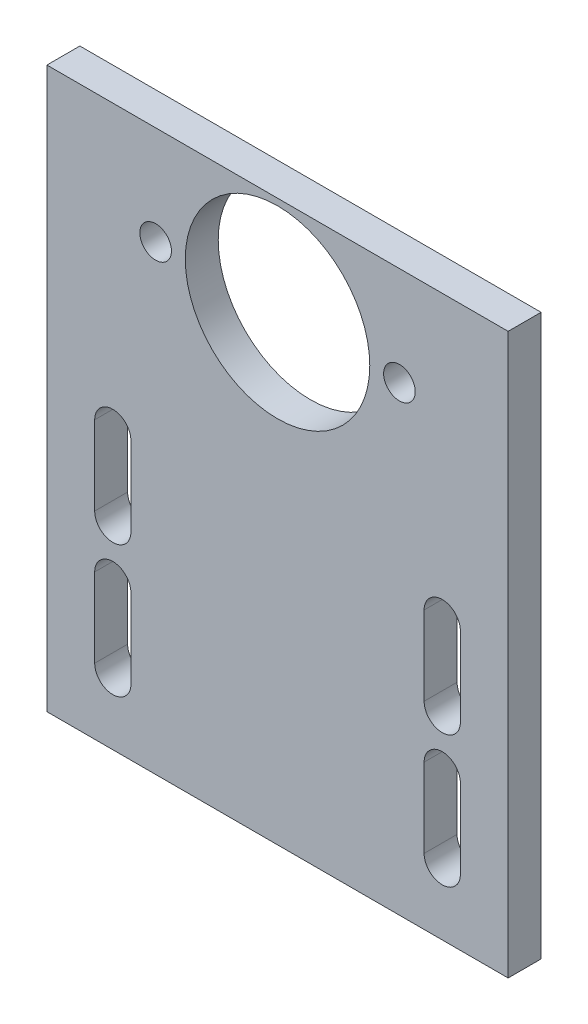
ISO-10303-21;
HEADER;
FILE_DESCRIPTION(('STEP AP214'),'2;1');
FILE_NAME('part.step','',(''),(''),'','','');
FILE_SCHEMA(('AUTOMOTIVE_DESIGN { 1 0 10303 214 1 1 1 1 }'));
ENDSEC;
DATA;
#1=APPLICATION_CONTEXT('core data for automotive mechanical design processes');
#2=APPLICATION_PROTOCOL_DEFINITION('international standard','automotive_design',2000,#1);
#3=PRODUCT_CONTEXT('',#1,'mechanical');
#4=PRODUCT('Part','Part','',(#3));
#5=PRODUCT_RELATED_PRODUCT_CATEGORY('part','',(#4));
#6=PRODUCT_DEFINITION_FORMATION('','',#4);
#7=PRODUCT_DEFINITION_CONTEXT('part definition',#1,'design');
#8=PRODUCT_DEFINITION('design','',#6,#7);
#9=PRODUCT_DEFINITION_SHAPE('','',#8);
#10=(LENGTH_UNIT() NAMED_UNIT(*) SI_UNIT(.MILLI.,.METRE.));
#11=(NAMED_UNIT(*) PLANE_ANGLE_UNIT() SI_UNIT($,.RADIAN.));
#12=(NAMED_UNIT(*) SI_UNIT($,.STERADIAN.) SOLID_ANGLE_UNIT());
#13=UNCERTAINTY_MEASURE_WITH_UNIT(LENGTH_MEASURE(1.E-05),#10,'distance_accuracy_value','');
#14=(GEOMETRIC_REPRESENTATION_CONTEXT(3) GLOBAL_UNCERTAINTY_ASSIGNED_CONTEXT((#13)) GLOBAL_UNIT_ASSIGNED_CONTEXT((#10,
#11,#12)) REPRESENTATION_CONTEXT('',''));
#15=CARTESIAN_POINT('',(0.,0.,0.));
#16=DIRECTION('',(0.,0.,1.));
#17=DIRECTION('',(1.,0.,0.));
#18=AXIS2_PLACEMENT_3D('',#15,#16,#17);
#19=CARTESIAN_POINT('',(22.25,0.,5.));
#20=DIRECTION('',(-1.,0.,0.));
#21=DIRECTION('',(0.,-1.,0.));
#22=AXIS2_PLACEMENT_3D('',#19,#20,#21);
#23=PLANE('',#22);
#24=DIRECTION('',(0.,1.,0.));
#25=VECTOR('',#24,1.);
#26=CARTESIAN_POINT('',(22.25,0.,0.));
#27=LINE('',#26,#25);
#28=CARTESIAN_POINT('',(22.25,-25.,0.));
#29=VERTEX_POINT('',#28);
#30=CARTESIAN_POINT('',(22.25,-13.,0.));
#31=VERTEX_POINT('',#30);
#32=EDGE_CURVE('E260',#29,#31,#27,.T.);
#33=ORIENTED_EDGE('',*,*,#32,.T.);
#34=DIRECTION('',(0.,0.,-1.));
#35=VECTOR('',#34,1.);
#36=CARTESIAN_POINT('',(22.25,-13.,5.));
#37=LINE('',#36,#35);
#38=CARTESIAN_POINT('',(22.25,-13.,5.));
#39=VERTEX_POINT('',#38);
#40=EDGE_CURVE('E11',#39,#31,#37,.T.);
#41=ORIENTED_EDGE('',*,*,#40,.F.);
#42=DIRECTION('',(0.,1.,0.));
#43=VECTOR('',#42,1.);
#44=CARTESIAN_POINT('',(22.25,0.,5.));
#45=LINE('',#44,#43);
#46=CARTESIAN_POINT('',(22.25,-25.,5.));
#47=VERTEX_POINT('',#46);
#48=EDGE_CURVE('E187',#47,#39,#45,.T.);
#49=ORIENTED_EDGE('',*,*,#48,.F.);
#50=DIRECTION('',(0.,0.,-1.));
#51=VECTOR('',#50,1.);
#52=CARTESIAN_POINT('',(22.25,-25.,5.));
#53=LINE('',#52,#51);
#54=EDGE_CURVE('E268',#47,#29,#53,.T.);
#55=ORIENTED_EDGE('',*,*,#54,.T.);
#56=EDGE_LOOP('',(#33,#41,#49,#55));
#57=FACE_BOUND('',#56,.T.);
#58=ADVANCED_FACE('F38',(#57),#23,.F.);
#59=CARTESIAN_POINT('',(25.,-13.,5.));
#60=DIRECTION('',(0.,0.,-1.));
#61=DIRECTION('',(-1.,0.,0.));
#62=AXIS2_PLACEMENT_3D('',#59,#60,#61);
#63=CYLINDRICAL_SURFACE('',#62,2.75);
#64=CARTESIAN_POINT('',(25.,-13.,0.));
#65=DIRECTION('',(0.,0.,1.));
#66=DIRECTION('',(1.,0.,0.));
#67=AXIS2_PLACEMENT_3D('',#64,#65,#66);
#68=CIRCLE('',#67,2.75);
#69=CARTESIAN_POINT('',(27.75,-13.,0.));
#70=VERTEX_POINT('',#69);
#71=EDGE_CURVE('E193',#31,#70,#68,.F.);
#72=ORIENTED_EDGE('',*,*,#71,.T.);
#73=DIRECTION('',(0.,0.,-1.));
#74=VECTOR('',#73,1.);
#75=CARTESIAN_POINT('',(27.75,-13.,5.));
#76=LINE('',#75,#74);
#77=CARTESIAN_POINT('',(27.75,-13.,5.));
#78=VERTEX_POINT('',#77);
#79=EDGE_CURVE('E48',#78,#70,#76,.T.);
#80=ORIENTED_EDGE('',*,*,#79,.F.);
#81=CARTESIAN_POINT('',(25.,-13.,5.));
#82=DIRECTION('',(0.,0.,1.));
#83=DIRECTION('',(1.,0.,0.));
#84=AXIS2_PLACEMENT_3D('',#81,#82,#83);
#85=CIRCLE('',#84,2.75);
#86=EDGE_CURVE('E181',#39,#78,#85,.F.);
#87=ORIENTED_EDGE('',*,*,#86,.F.);
#88=ORIENTED_EDGE('',*,*,#40,.T.);
#89=EDGE_LOOP('',(#72,#80,#87,#88));
#90=FACE_BOUND('',#89,.T.);
#91=ADVANCED_FACE('F192',(#90),#63,.F.);
#92=CARTESIAN_POINT('',(27.75,0.,5.));
#93=DIRECTION('',(-1.,0.,0.));
#94=DIRECTION('',(0.,-1.,0.));
#95=AXIS2_PLACEMENT_3D('',#92,#93,#94);
#96=PLANE('',#95);
#97=DIRECTION('',(0.,1.,0.));
#98=VECTOR('',#97,1.);
#99=CARTESIAN_POINT('',(27.75,0.,0.));
#100=LINE('',#99,#98);
#101=CARTESIAN_POINT('',(27.75,-25.,0.));
#102=VERTEX_POINT('',#101);
#103=EDGE_CURVE('E264',#102,#70,#100,.T.);
#104=ORIENTED_EDGE('',*,*,#103,.F.);
#105=DIRECTION('',(0.,0.,-1.));
#106=VECTOR('',#105,1.);
#107=CARTESIAN_POINT('',(27.75,-25.,5.));
#108=LINE('',#107,#106);
#109=CARTESIAN_POINT('',(27.75,-25.,5.));
#110=VERTEX_POINT('',#109);
#111=EDGE_CURVE('E121',#110,#102,#108,.T.);
#112=ORIENTED_EDGE('',*,*,#111,.F.);
#113=DIRECTION('',(0.,1.,0.));
#114=VECTOR('',#113,1.);
#115=CARTESIAN_POINT('',(27.75,0.,5.));
#116=LINE('',#115,#114);
#117=EDGE_CURVE('E185',#110,#78,#116,.T.);
#118=ORIENTED_EDGE('',*,*,#117,.T.);
#119=ORIENTED_EDGE('',*,*,#79,.T.);
#120=EDGE_LOOP('',(#104,#112,#118,#119));
#121=FACE_BOUND('',#120,.T.);
#122=ADVANCED_FACE('F198',(#121),#96,.T.);
#123=CARTESIAN_POINT('',(22.25,0.,5.));
#124=DIRECTION('',(-1.,0.,0.));
#125=DIRECTION('',(0.,-1.,0.));
#126=AXIS2_PLACEMENT_3D('',#123,#124,#125);
#127=PLANE('',#126);
#128=DIRECTION('',(0.,1.,0.));
#129=VECTOR('',#128,1.);
#130=CARTESIAN_POINT('',(22.25,0.,0.));
#131=LINE('',#130,#129);
#132=CARTESIAN_POINT('',(22.25,-5.00000000000002,0.));
#133=VERTEX_POINT('',#132);
#134=CARTESIAN_POINT('',(22.25,6.99999999999997,0.));
#135=VERTEX_POINT('',#134);
#136=EDGE_CURVE('E249',#133,#135,#131,.T.);
#137=ORIENTED_EDGE('',*,*,#136,.T.);
#138=DIRECTION('',(0.,0.,-1.));
#139=VECTOR('',#138,1.);
#140=CARTESIAN_POINT('',(22.25,6.99999999999997,5.));
#141=LINE('',#140,#139);
#142=CARTESIAN_POINT('',(22.25,6.99999999999997,5.));
#143=VERTEX_POINT('',#142);
#144=EDGE_CURVE('E270',#143,#135,#141,.T.);
#145=ORIENTED_EDGE('',*,*,#144,.F.);
#146=DIRECTION('',(0.,1.,0.));
#147=VECTOR('',#146,1.);
#148=CARTESIAN_POINT('',(22.25,0.,5.));
#149=LINE('',#148,#147);
#150=CARTESIAN_POINT('',(22.25,-5.00000000000002,5.));
#151=VERTEX_POINT('',#150);
#152=EDGE_CURVE('E360',#151,#143,#149,.T.);
#153=ORIENTED_EDGE('',*,*,#152,.F.);
#154=DIRECTION('',(0.,0.,-1.));
#155=VECTOR('',#154,1.);
#156=CARTESIAN_POINT('',(22.25,-5.00000000000002,5.));
#157=LINE('',#156,#155);
#158=EDGE_CURVE('E272',#151,#133,#157,.T.);
#159=ORIENTED_EDGE('',*,*,#158,.T.);
#160=EDGE_LOOP('',(#137,#145,#153,#159));
#161=FACE_BOUND('',#160,.T.);
#162=ADVANCED_FACE('F380',(#161),#127,.F.);
#163=CARTESIAN_POINT('',(25.,6.99999999999997,5.));
#164=DIRECTION('',(0.,0.,-1.));
#165=DIRECTION('',(-1.,0.,0.));
#166=AXIS2_PLACEMENT_3D('',#163,#164,#165);
#167=CYLINDRICAL_SURFACE('',#166,2.75);
#168=CARTESIAN_POINT('',(25.,6.99999999999997,0.));
#169=DIRECTION('',(0.,0.,1.));
#170=DIRECTION('',(1.,0.,0.));
#171=AXIS2_PLACEMENT_3D('',#168,#169,#170);
#172=CIRCLE('',#171,2.75);
#173=CARTESIAN_POINT('',(27.75,6.99999999999997,0.));
#174=VERTEX_POINT('',#173);
#175=EDGE_CURVE('E252',#135,#174,#172,.F.);
#176=ORIENTED_EDGE('',*,*,#175,.T.);
#177=DIRECTION('',(0.,0.,-1.));
#178=VECTOR('',#177,1.);
#179=CARTESIAN_POINT('',(27.75,6.99999999999997,5.));
#180=LINE('',#179,#178);
#181=CARTESIAN_POINT('',(27.75,6.99999999999997,5.));
#182=VERTEX_POINT('',#181);
#183=EDGE_CURVE('E278',#182,#174,#180,.T.);
#184=ORIENTED_EDGE('',*,*,#183,.F.);
#185=CARTESIAN_POINT('',(25.,6.99999999999997,5.));
#186=DIRECTION('',(0.,0.,1.));
#187=DIRECTION('',(1.,0.,0.));
#188=AXIS2_PLACEMENT_3D('',#185,#186,#187);
#189=CIRCLE('',#188,2.75);
#190=EDGE_CURVE('E363',#143,#182,#189,.F.);
#191=ORIENTED_EDGE('',*,*,#190,.F.);
#192=ORIENTED_EDGE('',*,*,#144,.T.);
#193=EDGE_LOOP('',(#176,#184,#191,#192));
#194=FACE_BOUND('',#193,.T.);
#195=ADVANCED_FACE('F382',(#194),#167,.F.);
#196=CARTESIAN_POINT('',(27.75,0.,5.));
#197=DIRECTION('',(-1.,0.,0.));
#198=DIRECTION('',(0.,-1.,0.));
#199=AXIS2_PLACEMENT_3D('',#196,#197,#198);
#200=PLANE('',#199);
#201=DIRECTION('',(0.,1.,0.));
#202=VECTOR('',#201,1.);
#203=CARTESIAN_POINT('',(27.75,0.,0.));
#204=LINE('',#203,#202);
#205=CARTESIAN_POINT('',(27.75,-5.00000000000002,0.));
#206=VERTEX_POINT('',#205);
#207=EDGE_CURVE('E255',#206,#174,#204,.T.);
#208=ORIENTED_EDGE('',*,*,#207,.F.);
#209=DIRECTION('',(0.,0.,-1.));
#210=VECTOR('',#209,1.);
#211=CARTESIAN_POINT('',(27.75,-5.00000000000002,5.));
#212=LINE('',#211,#210);
#213=CARTESIAN_POINT('',(27.75,-5.00000000000002,5.));
#214=VERTEX_POINT('',#213);
#215=EDGE_CURVE('E275',#214,#206,#212,.T.);
#216=ORIENTED_EDGE('',*,*,#215,.F.);
#217=DIRECTION('',(0.,1.,0.));
#218=VECTOR('',#217,1.);
#219=CARTESIAN_POINT('',(27.75,0.,5.));
#220=LINE('',#219,#218);
#221=EDGE_CURVE('E365',#214,#182,#220,.T.);
#222=ORIENTED_EDGE('',*,*,#221,.T.);
#223=ORIENTED_EDGE('',*,*,#183,.T.);
#224=EDGE_LOOP('',(#208,#216,#222,#223));
#225=FACE_BOUND('',#224,.T.);
#226=ADVANCED_FACE('F386',(#225),#200,.T.);
#227=CARTESIAN_POINT('',(0.,50.,5.));
#228=DIRECTION('',(0.,1.,0.));
#229=DIRECTION('',(0.,0.,1.));
#230=AXIS2_PLACEMENT_3D('',#227,#228,#229);
#231=PLANE('',#230);
#232=DIRECTION('',(1.,0.,0.));
#233=VECTOR('',#232,1.);
#234=CARTESIAN_POINT('',(0.,50.,0.));
#235=LINE('',#234,#233);
#236=CARTESIAN_POINT('',(-35.,50.,0.));
#237=VERTEX_POINT('',#236);
#238=CARTESIAN_POINT('',(35.,50.,0.));
#239=VERTEX_POINT('',#238);
#240=EDGE_CURVE('E237',#237,#239,#235,.T.);
#241=ORIENTED_EDGE('',*,*,#240,.F.);
#242=DIRECTION('',(0.,0.,-1.));
#243=VECTOR('',#242,1.);
#244=CARTESIAN_POINT('',(-35.,50.,5.));
#245=LINE('',#244,#243);
#246=CARTESIAN_POINT('',(-35.,50.,5.));
#247=VERTEX_POINT('',#246);
#248=EDGE_CURVE('E276',#247,#237,#245,.T.);
#249=ORIENTED_EDGE('',*,*,#248,.F.);
#250=DIRECTION('',(1.,0.,0.));
#251=VECTOR('',#250,1.);
#252=CARTESIAN_POINT('',(0.,50.,5.));
#253=LINE('',#252,#251);
#254=CARTESIAN_POINT('',(35.,50.,5.));
#255=VERTEX_POINT('',#254);
#256=EDGE_CURVE('E349',#247,#255,#253,.T.);
#257=ORIENTED_EDGE('',*,*,#256,.T.);
#258=DIRECTION('',(0.,0.,-1.));
#259=VECTOR('',#258,1.);
#260=CARTESIAN_POINT('',(35.,50.,5.));
#261=LINE('',#260,#259);
#262=EDGE_CURVE('E282',#255,#239,#261,.T.);
#263=ORIENTED_EDGE('',*,*,#262,.T.);
#264=EDGE_LOOP('',(#241,#249,#257,#263));
#265=FACE_BOUND('',#264,.T.);
#266=ADVANCED_FACE('F416',(#265),#231,.T.);
#267=CARTESIAN_POINT('',(-35.,0.,5.));
#268=DIRECTION('',(-1.,0.,0.));
#269=DIRECTION('',(0.,-1.,0.));
#270=AXIS2_PLACEMENT_3D('',#267,#268,#269);
#271=PLANE('',#270);
#272=DIRECTION('',(0.,1.,0.));
#273=VECTOR('',#272,1.);
#274=CARTESIAN_POINT('',(-35.,0.,0.));
#275=LINE('',#274,#273);
#276=CARTESIAN_POINT('',(-35.,-35.,0.));
#277=VERTEX_POINT('',#276);
#278=EDGE_CURVE('E240',#277,#237,#275,.T.);
#279=ORIENTED_EDGE('',*,*,#278,.F.);
#280=DIRECTION('',(0.,0.,-1.));
#281=VECTOR('',#280,1.);
#282=CARTESIAN_POINT('',(-35.,-35.,5.));
#283=LINE('',#282,#281);
#284=CARTESIAN_POINT('',(-35.,-35.,5.));
#285=VERTEX_POINT('',#284);
#286=EDGE_CURVE('E288',#285,#277,#283,.T.);
#287=ORIENTED_EDGE('',*,*,#286,.F.);
#288=DIRECTION('',(0.,1.,0.));
#289=VECTOR('',#288,1.);
#290=CARTESIAN_POINT('',(-35.,0.,5.));
#291=LINE('',#290,#289);
#292=EDGE_CURVE('E352',#285,#247,#291,.T.);
#293=ORIENTED_EDGE('',*,*,#292,.T.);
#294=ORIENTED_EDGE('',*,*,#248,.T.);
#295=EDGE_LOOP('',(#279,#287,#293,#294));
#296=FACE_BOUND('',#295,.T.);
#297=ADVANCED_FACE('F429',(#296),#271,.T.);
#298=CARTESIAN_POINT('',(0.,-35.,5.));
#299=DIRECTION('',(0.,1.,0.));
#300=DIRECTION('',(0.,0.,1.));
#301=AXIS2_PLACEMENT_3D('',#298,#299,#300);
#302=PLANE('',#301);
#303=DIRECTION('',(1.,0.,0.));
#304=VECTOR('',#303,1.);
#305=CARTESIAN_POINT('',(0.,-35.,0.));
#306=LINE('',#305,#304);
#307=CARTESIAN_POINT('',(35.,-35.,0.));
#308=VERTEX_POINT('',#307);
#309=EDGE_CURVE('E243',#277,#308,#306,.T.);
#310=ORIENTED_EDGE('',*,*,#309,.T.);
#311=DIRECTION('',(0.,0.,-1.));
#312=VECTOR('',#311,1.);
#313=CARTESIAN_POINT('',(35.,-35.,5.));
#314=LINE('',#313,#312);
#315=CARTESIAN_POINT('',(35.,-35.,5.));
#316=VERTEX_POINT('',#315);
#317=EDGE_CURVE('E284',#316,#308,#314,.T.);
#318=ORIENTED_EDGE('',*,*,#317,.F.);
#319=DIRECTION('',(1.,0.,0.));
#320=VECTOR('',#319,1.);
#321=CARTESIAN_POINT('',(0.,-35.,5.));
#322=LINE('',#321,#320);
#323=EDGE_CURVE('E355',#285,#316,#322,.T.);
#324=ORIENTED_EDGE('',*,*,#323,.F.);
#325=ORIENTED_EDGE('',*,*,#286,.T.);
#326=EDGE_LOOP('',(#310,#318,#324,#325));
#327=FACE_BOUND('',#326,.T.);
#328=ADVANCED_FACE('F425',(#327),#302,.F.);
#329=CARTESIAN_POINT('',(-25.,6.99999999999997,5.));
#330=DIRECTION('',(0.,0.,-1.));
#331=DIRECTION('',(-1.,0.,0.));
#332=AXIS2_PLACEMENT_3D('',#329,#330,#331);
#333=CYLINDRICAL_SURFACE('',#332,2.75);
#334=CARTESIAN_POINT('',(-25.,6.99999999999997,0.));
#335=DIRECTION('',(0.,0.,1.));
#336=DIRECTION('',(1.,0.,0.));
#337=AXIS2_PLACEMENT_3D('',#334,#335,#336);
#338=CIRCLE('',#337,2.75);
#339=CARTESIAN_POINT('',(-22.25,6.99999999999997,0.));
#340=VERTEX_POINT('',#339);
#341=CARTESIAN_POINT('',(-27.75,6.99999999999997,0.));
#342=VERTEX_POINT('',#341);
#343=EDGE_CURVE('E216',#340,#342,#338,.T.);
#344=ORIENTED_EDGE('',*,*,#343,.F.);
#345=DIRECTION('',(0.,0.,-1.));
#346=VECTOR('',#345,1.);
#347=CARTESIAN_POINT('',(-22.25,6.99999999999997,5.));
#348=LINE('',#347,#346);
#349=CARTESIAN_POINT('',(-22.25,6.99999999999997,5.));
#350=VERTEX_POINT('',#349);
#351=EDGE_CURVE('E285',#350,#340,#348,.T.);
#352=ORIENTED_EDGE('',*,*,#351,.F.);
#353=CARTESIAN_POINT('',(-25.,6.99999999999997,5.));
#354=DIRECTION('',(0.,0.,1.));
#355=DIRECTION('',(1.,0.,0.));
#356=AXIS2_PLACEMENT_3D('',#353,#354,#355);
#357=CIRCLE('',#356,2.75);
#358=CARTESIAN_POINT('',(-27.75,6.99999999999997,5.));
#359=VERTEX_POINT('',#358);
#360=EDGE_CURVE('E323',#350,#359,#357,.T.);
#361=ORIENTED_EDGE('',*,*,#360,.T.);
#362=DIRECTION('',(0.,0.,-1.));
#363=VECTOR('',#362,1.);
#364=CARTESIAN_POINT('',(-27.75,6.99999999999997,5.));
#365=LINE('',#364,#363);
#366=EDGE_CURVE('E291',#359,#342,#365,.T.);
#367=ORIENTED_EDGE('',*,*,#366,.T.);
#368=EDGE_LOOP('',(#344,#352,#361,#367));
#369=FACE_BOUND('',#368,.T.);
#370=ADVANCED_FACE('F428',(#369),#333,.F.);
#371=CARTESIAN_POINT('',(-22.25,0.,5.));
#372=DIRECTION('',(-1.,0.,0.));
#373=DIRECTION('',(0.,0.,1.));
#374=AXIS2_PLACEMENT_3D('',#371,#372,#373);
#375=PLANE('',#374);
#376=DIRECTION('',(0.,1.,0.));
#377=VECTOR('',#376,1.);
#378=CARTESIAN_POINT('',(-22.25,0.,0.));
#379=LINE('',#378,#377);
#380=CARTESIAN_POINT('',(-22.25,-5.00000000000003,0.));
#381=VERTEX_POINT('',#380);
#382=EDGE_CURVE('E219',#381,#340,#379,.T.);
#383=ORIENTED_EDGE('',*,*,#382,.F.);
#384=DIRECTION('',(0.,0.,-1.));
#385=VECTOR('',#384,1.);
#386=CARTESIAN_POINT('',(-22.25,-5.00000000000003,5.));
#387=LINE('',#386,#385);
#388=CARTESIAN_POINT('',(-22.25,-5.00000000000003,5.));
#389=VERTEX_POINT('',#388);
#390=EDGE_CURVE('E295',#389,#381,#387,.T.);
#391=ORIENTED_EDGE('',*,*,#390,.F.);
#392=DIRECTION('',(0.,1.,0.));
#393=VECTOR('',#392,1.);
#394=CARTESIAN_POINT('',(-22.25,0.,5.));
#395=LINE('',#394,#393);
#396=EDGE_CURVE('E332',#389,#350,#395,.T.);
#397=ORIENTED_EDGE('',*,*,#396,.T.);
#398=ORIENTED_EDGE('',*,*,#351,.T.);
#399=EDGE_LOOP('',(#383,#391,#397,#398));
#400=FACE_BOUND('',#399,.T.);
#401=ADVANCED_FACE('F454',(#400),#375,.T.);
#402=CARTESIAN_POINT('',(-25.,-5.00000000000003,5.));
#403=DIRECTION('',(0.,0.,-1.));
#404=DIRECTION('',(-1.,0.,0.));
#405=AXIS2_PLACEMENT_3D('',#402,#403,#404);
#406=CYLINDRICAL_SURFACE('',#405,2.75);
#407=CARTESIAN_POINT('',(-25.,-5.00000000000003,0.));
#408=DIRECTION('',(0.,0.,1.));
#409=DIRECTION('',(1.,0.,0.));
#410=AXIS2_PLACEMENT_3D('',#407,#408,#409);
#411=CIRCLE('',#410,2.75);
#412=CARTESIAN_POINT('',(-27.75,-5.00000000000003,0.));
#413=VERTEX_POINT('',#412);
#414=EDGE_CURVE('E222',#413,#381,#411,.T.);
#415=ORIENTED_EDGE('',*,*,#414,.F.);
#416=DIRECTION('',(0.,0.,-1.));
#417=VECTOR('',#416,1.);
#418=CARTESIAN_POINT('',(-27.75,-5.00000000000003,5.));
#419=LINE('',#418,#417);
#420=CARTESIAN_POINT('',(-27.75,-5.00000000000003,5.));
#421=VERTEX_POINT('',#420);
#422=EDGE_CURVE('E293',#421,#413,#419,.T.);
#423=ORIENTED_EDGE('',*,*,#422,.F.);
#424=CARTESIAN_POINT('',(-25.,-5.00000000000003,5.));
#425=DIRECTION('',(0.,0.,1.));
#426=DIRECTION('',(1.,0.,0.));
#427=AXIS2_PLACEMENT_3D('',#424,#425,#426);
#428=CIRCLE('',#427,2.75);
#429=EDGE_CURVE('E335',#421,#389,#428,.T.);
#430=ORIENTED_EDGE('',*,*,#429,.T.);
#431=ORIENTED_EDGE('',*,*,#390,.T.);
#432=EDGE_LOOP('',(#415,#423,#430,#431));
#433=FACE_BOUND('',#432,.T.);
#434=ADVANCED_FACE('F451',(#433),#406,.F.);
#435=CARTESIAN_POINT('',(-25.,-13.,5.));
#436=DIRECTION('',(0.,0.,-1.));
#437=DIRECTION('',(-1.,0.,0.));
#438=AXIS2_PLACEMENT_3D('',#435,#436,#437);
#439=CYLINDRICAL_SURFACE('',#438,2.75);
#440=CARTESIAN_POINT('',(-25.,-13.,0.));
#441=DIRECTION('',(0.,0.,1.));
#442=DIRECTION('',(1.,0.,0.));
#443=AXIS2_PLACEMENT_3D('',#440,#441,#442);
#444=CIRCLE('',#443,2.75);
#445=CARTESIAN_POINT('',(-22.25,-13.,0.));
#446=VERTEX_POINT('',#445);
#447=CARTESIAN_POINT('',(-27.75,-13.,0.));
#448=VERTEX_POINT('',#447);
#449=EDGE_CURVE('E204',#446,#448,#444,.T.);
#450=ORIENTED_EDGE('',*,*,#449,.F.);
#451=DIRECTION('',(0.,0.,-1.));
#452=VECTOR('',#451,1.);
#453=CARTESIAN_POINT('',(-22.25,-13.,5.));
#454=LINE('',#453,#452);
#455=CARTESIAN_POINT('',(-22.25,-13.,5.));
#456=VERTEX_POINT('',#455);
#457=EDGE_CURVE('E42',#456,#446,#454,.T.);
#458=ORIENTED_EDGE('',*,*,#457,.F.);
#459=CARTESIAN_POINT('',(-25.,-13.,5.));
#460=DIRECTION('',(0.,0.,1.));
#461=DIRECTION('',(1.,0.,0.));
#462=AXIS2_PLACEMENT_3D('',#459,#460,#461);
#463=CIRCLE('',#462,2.75);
#464=CARTESIAN_POINT('',(-27.75,-13.,5.));
#465=VERTEX_POINT('',#464);
#466=EDGE_CURVE('E267',#456,#465,#463,.T.);
#467=ORIENTED_EDGE('',*,*,#466,.T.);
#468=DIRECTION('',(0.,0.,-1.));
#469=VECTOR('',#468,1.);
#470=CARTESIAN_POINT('',(-27.75,-13.,5.));
#471=LINE('',#470,#469);
#472=EDGE_CURVE('E200',#465,#448,#471,.T.);
#473=ORIENTED_EDGE('',*,*,#472,.T.);
#474=EDGE_LOOP('',(#450,#458,#467,#473));
#475=FACE_BOUND('',#474,.T.);
#476=ADVANCED_FACE('F40',(#475),#439,.F.);
#477=CARTESIAN_POINT('',(-22.25,0.,5.));
#478=DIRECTION('',(-1.,0.,0.));
#479=DIRECTION('',(0.,0.,1.));
#480=AXIS2_PLACEMENT_3D('',#477,#478,#479);
#481=PLANE('',#480);
#482=DIRECTION('',(0.,1.,0.));
#483=VECTOR('',#482,1.);
#484=CARTESIAN_POINT('',(-22.25,0.,0.));
#485=LINE('',#484,#483);
#486=CARTESIAN_POINT('',(-22.25,-25.,0.));
#487=VERTEX_POINT('',#486);
#488=EDGE_CURVE('E207',#487,#446,#485,.T.);
#489=ORIENTED_EDGE('',*,*,#488,.F.);
#490=DIRECTION('',(0.,0.,-1.));
#491=VECTOR('',#490,1.);
#492=CARTESIAN_POINT('',(-22.25,-25.,5.));
#493=LINE('',#492,#491);
#494=CARTESIAN_POINT('',(-22.25,-25.,5.));
#495=VERTEX_POINT('',#494);
#496=EDGE_CURVE('E300',#495,#487,#493,.T.);
#497=ORIENTED_EDGE('',*,*,#496,.F.);
#498=DIRECTION('',(0.,1.,0.));
#499=VECTOR('',#498,1.);
#500=CARTESIAN_POINT('',(-22.25,0.,5.));
#501=LINE('',#500,#499);
#502=EDGE_CURVE('E309',#495,#456,#501,.T.);
#503=ORIENTED_EDGE('',*,*,#502,.T.);
#504=ORIENTED_EDGE('',*,*,#457,.T.);
#505=EDGE_LOOP('',(#489,#497,#503,#504));
#506=FACE_BOUND('',#505,.T.);
#507=ADVANCED_FACE('F307',(#506),#481,.T.);
#508=CARTESIAN_POINT('',(-25.,-25.,5.));
#509=DIRECTION('',(0.,0.,-1.));
#510=DIRECTION('',(-1.,0.,0.));
#511=AXIS2_PLACEMENT_3D('',#508,#509,#510);
#512=CYLINDRICAL_SURFACE('',#511,2.75);
#513=CARTESIAN_POINT('',(-25.,-25.,0.));
#514=DIRECTION('',(0.,0.,1.));
#515=DIRECTION('',(1.,0.,0.));
#516=AXIS2_PLACEMENT_3D('',#513,#514,#515);
#517=CIRCLE('',#516,2.75);
#518=CARTESIAN_POINT('',(-27.75,-25.,0.));
#519=VERTEX_POINT('',#518);
#520=EDGE_CURVE('E210',#519,#487,#517,.T.);
#521=ORIENTED_EDGE('',*,*,#520,.F.);
#522=DIRECTION('',(0.,0.,-1.));
#523=VECTOR('',#522,1.);
#524=CARTESIAN_POINT('',(-27.75,-25.,5.));
#525=LINE('',#524,#523);
#526=CARTESIAN_POINT('',(-27.75,-25.,5.));
#527=VERTEX_POINT('',#526);
#528=EDGE_CURVE('E299',#527,#519,#525,.T.);
#529=ORIENTED_EDGE('',*,*,#528,.F.);
#530=CARTESIAN_POINT('',(-25.,-25.,5.));
#531=DIRECTION('',(0.,0.,1.));
#532=DIRECTION('',(1.,0.,0.));
#533=AXIS2_PLACEMENT_3D('',#530,#531,#532);
#534=CIRCLE('',#533,2.75);
#535=EDGE_CURVE('E318',#527,#495,#534,.T.);
#536=ORIENTED_EDGE('',*,*,#535,.T.);
#537=ORIENTED_EDGE('',*,*,#496,.T.);
#538=EDGE_LOOP('',(#521,#529,#536,#537));
#539=FACE_BOUND('',#538,.T.);
#540=ADVANCED_FACE('F315',(#539),#512,.F.);
#541=CARTESIAN_POINT('',(25.,-5.00000000000003,5.));
#542=DIRECTION('',(0.,0.,-1.));
#543=DIRECTION('',(-1.,0.,0.));
#544=AXIS2_PLACEMENT_3D('',#541,#542,#543);
#545=CYLINDRICAL_SURFACE('',#544,2.75);
#546=CARTESIAN_POINT('',(25.,-5.00000000000003,0.));
#547=DIRECTION('',(0.,0.,1.));
#548=DIRECTION('',(1.,0.,0.));
#549=AXIS2_PLACEMENT_3D('',#546,#547,#548);
#550=CIRCLE('',#549,2.75);
#551=EDGE_CURVE('E258',#206,#133,#550,.F.);
#552=ORIENTED_EDGE('',*,*,#551,.T.);
#553=ORIENTED_EDGE('',*,*,#158,.F.);
#554=CARTESIAN_POINT('',(25.,-5.00000000000003,5.));
#555=DIRECTION('',(0.,0.,1.));
#556=DIRECTION('',(1.,0.,0.));
#557=AXIS2_PLACEMENT_3D('',#554,#555,#556);
#558=CIRCLE('',#557,2.75);
#559=EDGE_CURVE('E368',#214,#151,#558,.F.);
#560=ORIENTED_EDGE('',*,*,#559,.F.);
#561=ORIENTED_EDGE('',*,*,#215,.T.);
#562=EDGE_LOOP('',(#552,#553,#560,#561));
#563=FACE_BOUND('',#562,.T.);
#564=ADVANCED_FACE('F376',(#563),#545,.F.);
#565=CARTESIAN_POINT('',(35.,0.,5.));
#566=DIRECTION('',(-1.,0.,0.));
#567=DIRECTION('',(0.,-1.,0.));
#568=AXIS2_PLACEMENT_3D('',#565,#566,#567);
#569=PLANE('',#568);
#570=DIRECTION('',(0.,1.,0.));
#571=VECTOR('',#570,1.);
#572=CARTESIAN_POINT('',(35.,0.,0.));
#573=LINE('',#572,#571);
#574=EDGE_CURVE('E246',#308,#239,#573,.T.);
#575=ORIENTED_EDGE('',*,*,#574,.T.);
#576=ORIENTED_EDGE('',*,*,#262,.F.);
#577=DIRECTION('',(0.,1.,0.));
#578=VECTOR('',#577,1.);
#579=CARTESIAN_POINT('',(35.,0.,5.));
#580=LINE('',#579,#578);
#581=EDGE_CURVE('E358',#316,#255,#580,.T.);
#582=ORIENTED_EDGE('',*,*,#581,.F.);
#583=ORIENTED_EDGE('',*,*,#317,.T.);
#584=EDGE_LOOP('',(#575,#576,#582,#583));
#585=FACE_BOUND('',#584,.T.);
#586=ADVANCED_FACE('F413',(#585),#569,.F.);
#587=CARTESIAN_POINT('',(-18.5,35.,5.));
#588=DIRECTION('',(0.,0.,-1.));
#589=DIRECTION('',(-1.,0.,0.));
#590=AXIS2_PLACEMENT_3D('',#587,#588,#589);
#591=CYLINDRICAL_SURFACE('',#590,2.4);
#592=CARTESIAN_POINT('',(-18.5,35.,5.));
#593=DIRECTION('',(0.,0.,1.));
#594=DIRECTION('',(1.,0.,0.));
#595=AXIS2_PLACEMENT_3D('',#592,#593,#594);
#596=CIRCLE('',#595,2.4);
#597=CARTESIAN_POINT('',(-16.1,35.,5.));
#598=VERTEX_POINT('',#597);
#599=EDGE_CURVE('E346',#598,#598,#596,.T.);
#600=ORIENTED_EDGE('',*,*,#599,.T.);
#601=EDGE_LOOP('',(#600));
#602=FACE_BOUND('',#601,.T.);
#603=CARTESIAN_POINT('',(-18.5,35.,0.));
#604=DIRECTION('',(0.,0.,1.));
#605=DIRECTION('',(1.,0.,0.));
#606=AXIS2_PLACEMENT_3D('',#603,#604,#605);
#607=CIRCLE('',#606,2.4);
#608=CARTESIAN_POINT('',(-16.1,35.,0.));
#609=VERTEX_POINT('',#608);
#610=EDGE_CURVE('E234',#609,#609,#607,.T.);
#611=ORIENTED_EDGE('',*,*,#610,.F.);
#612=EDGE_LOOP('',(#611));
#613=FACE_BOUND('',#612,.T.);
#614=ADVANCED_FACE('F423',(#602,#613),#591,.F.);
#615=CARTESIAN_POINT('',(18.5,35.,5.));
#616=DIRECTION('',(0.,0.,-1.));
#617=DIRECTION('',(-1.,0.,0.));
#618=AXIS2_PLACEMENT_3D('',#615,#616,#617);
#619=CYLINDRICAL_SURFACE('',#618,2.4);
#620=CARTESIAN_POINT('',(18.5,35.,5.));
#621=DIRECTION('',(0.,0.,1.));
#622=DIRECTION('',(1.,0.,0.));
#623=AXIS2_PLACEMENT_3D('',#620,#621,#622);
#624=CIRCLE('',#623,2.4);
#625=CARTESIAN_POINT('',(20.9,35.,5.));
#626=VERTEX_POINT('',#625);
#627=EDGE_CURVE('E343',#626,#626,#624,.T.);
#628=ORIENTED_EDGE('',*,*,#627,.T.);
#629=EDGE_LOOP('',(#628));
#630=FACE_BOUND('',#629,.T.);
#631=CARTESIAN_POINT('',(18.5,35.,0.));
#632=DIRECTION('',(0.,0.,1.));
#633=DIRECTION('',(1.,0.,0.));
#634=AXIS2_PLACEMENT_3D('',#631,#632,#633);
#635=CIRCLE('',#634,2.4);
#636=CARTESIAN_POINT('',(20.9,35.,0.));
#637=VERTEX_POINT('',#636);
#638=EDGE_CURVE('E231',#637,#637,#635,.T.);
#639=ORIENTED_EDGE('',*,*,#638,.F.);
#640=EDGE_LOOP('',(#639));
#641=FACE_BOUND('',#640,.T.);
#642=ADVANCED_FACE('F439',(#630,#641),#619,.F.);
#643=CARTESIAN_POINT('',(0.,35.,5.));
#644=DIRECTION('',(0.,0.,-1.));
#645=DIRECTION('',(-1.,0.,0.));
#646=AXIS2_PLACEMENT_3D('',#643,#644,#645);
#647=CYLINDRICAL_SURFACE('',#646,14.);
#648=CARTESIAN_POINT('',(0.,35.,5.));
#649=DIRECTION('',(0.,0.,1.));
#650=DIRECTION('',(1.,0.,0.));
#651=AXIS2_PLACEMENT_3D('',#648,#649,#650);
#652=CIRCLE('',#651,14.);
#653=CARTESIAN_POINT('',(14.,35.,5.));
#654=VERTEX_POINT('',#653);
#655=EDGE_CURVE('E340',#654,#654,#652,.T.);
#656=ORIENTED_EDGE('',*,*,#655,.T.);
#657=EDGE_LOOP('',(#656));
#658=FACE_BOUND('',#657,.T.);
#659=CARTESIAN_POINT('',(0.,35.,0.));
#660=DIRECTION('',(0.,0.,1.));
#661=DIRECTION('',(1.,0.,0.));
#662=AXIS2_PLACEMENT_3D('',#659,#660,#661);
#663=CIRCLE('',#662,14.);
#664=CARTESIAN_POINT('',(14.,35.,0.));
#665=VERTEX_POINT('',#664);
#666=EDGE_CURVE('E228',#665,#665,#663,.T.);
#667=ORIENTED_EDGE('',*,*,#666,.F.);
#668=EDGE_LOOP('',(#667));
#669=FACE_BOUND('',#668,.T.);
#670=ADVANCED_FACE('F443',(#658,#669),#647,.F.);
#671=CARTESIAN_POINT('',(-27.75,0.,5.));
#672=DIRECTION('',(-1.,0.,0.));
#673=DIRECTION('',(0.,0.,1.));
#674=AXIS2_PLACEMENT_3D('',#671,#672,#673);
#675=PLANE('',#674);
#676=DIRECTION('',(0.,1.,0.));
#677=VECTOR('',#676,1.);
#678=CARTESIAN_POINT('',(-27.75,0.,0.));
#679=LINE('',#678,#677);
#680=EDGE_CURVE('E225',#413,#342,#679,.T.);
#681=ORIENTED_EDGE('',*,*,#680,.T.);
#682=ORIENTED_EDGE('',*,*,#366,.F.);
#683=DIRECTION('',(0.,1.,0.));
#684=VECTOR('',#683,1.);
#685=CARTESIAN_POINT('',(-27.75,0.,5.));
#686=LINE('',#685,#684);
#687=EDGE_CURVE('E338',#421,#359,#686,.T.);
#688=ORIENTED_EDGE('',*,*,#687,.F.);
#689=ORIENTED_EDGE('',*,*,#422,.T.);
#690=EDGE_LOOP('',(#681,#682,#688,#689));
#691=FACE_BOUND('',#690,.T.);
#692=ADVANCED_FACE('F401',(#691),#675,.F.);
#693=CARTESIAN_POINT('',(-27.75,0.,5.));
#694=DIRECTION('',(-1.,0.,0.));
#695=DIRECTION('',(0.,0.,1.));
#696=AXIS2_PLACEMENT_3D('',#693,#694,#695);
#697=PLANE('',#696);
#698=DIRECTION('',(0.,1.,0.));
#699=VECTOR('',#698,1.);
#700=CARTESIAN_POINT('',(-27.75,0.,0.));
#701=LINE('',#700,#699);
#702=EDGE_CURVE('E213',#519,#448,#701,.T.);
#703=ORIENTED_EDGE('',*,*,#702,.T.);
#704=ORIENTED_EDGE('',*,*,#472,.F.);
#705=DIRECTION('',(0.,1.,0.));
#706=VECTOR('',#705,1.);
#707=CARTESIAN_POINT('',(-27.75,0.,5.));
#708=LINE('',#707,#706);
#709=EDGE_CURVE('E320',#527,#465,#708,.T.);
#710=ORIENTED_EDGE('',*,*,#709,.F.);
#711=ORIENTED_EDGE('',*,*,#528,.T.);
#712=EDGE_LOOP('',(#703,#704,#710,#711));
#713=FACE_BOUND('',#712,.T.);
#714=ADVANCED_FACE('F321',(#713),#697,.F.);
#715=CARTESIAN_POINT('',(25.,-25.,5.));
#716=DIRECTION('',(0.,0.,-1.));
#717=DIRECTION('',(-1.,0.,0.));
#718=AXIS2_PLACEMENT_3D('',#715,#716,#717);
#719=CYLINDRICAL_SURFACE('',#718,2.75);
#720=CARTESIAN_POINT('',(25.,-25.,0.));
#721=DIRECTION('',(0.,0.,1.));
#722=DIRECTION('',(1.,0.,0.));
#723=AXIS2_PLACEMENT_3D('',#720,#721,#722);
#724=CIRCLE('',#723,2.75);
#725=EDGE_CURVE('E124',#102,#29,#724,.F.);
#726=ORIENTED_EDGE('',*,*,#725,.T.);
#727=ORIENTED_EDGE('',*,*,#54,.F.);
#728=CARTESIAN_POINT('',(25.,-25.,5.));
#729=DIRECTION('',(0.,0.,1.));
#730=DIRECTION('',(1.,0.,0.));
#731=AXIS2_PLACEMENT_3D('',#728,#729,#730);
#732=CIRCLE('',#731,2.75);
#733=EDGE_CURVE('E57',#110,#47,#732,.F.);
#734=ORIENTED_EDGE('',*,*,#733,.F.);
#735=ORIENTED_EDGE('',*,*,#111,.T.);
#736=EDGE_LOOP('',(#726,#727,#734,#735));
#737=FACE_BOUND('',#736,.T.);
#738=ADVANCED_FACE('F393',(#737),#719,.F.);
#739=CARTESIAN_POINT('',(0.,0.,5.));
#740=DIRECTION('',(0.,0.,1.));
#741=DIRECTION('',(1.,0.,0.));
#742=AXIS2_PLACEMENT_3D('',#739,#740,#741);
#743=PLANE('',#742);
#744=ORIENTED_EDGE('',*,*,#466,.F.);
#745=ORIENTED_EDGE('',*,*,#502,.F.);
#746=ORIENTED_EDGE('',*,*,#535,.F.);
#747=ORIENTED_EDGE('',*,*,#709,.T.);
#748=EDGE_LOOP('',(#744,#745,#746,#747));
#749=FACE_BOUND('',#748,.T.);
#750=ORIENTED_EDGE('',*,*,#360,.F.);
#751=ORIENTED_EDGE('',*,*,#396,.F.);
#752=ORIENTED_EDGE('',*,*,#429,.F.);
#753=ORIENTED_EDGE('',*,*,#687,.T.);
#754=EDGE_LOOP('',(#750,#751,#752,#753));
#755=FACE_BOUND('',#754,.T.);
#756=ORIENTED_EDGE('',*,*,#655,.F.);
#757=EDGE_LOOP('',(#756));
#758=FACE_BOUND('',#757,.T.);
#759=ORIENTED_EDGE('',*,*,#627,.F.);
#760=EDGE_LOOP('',(#759));
#761=FACE_BOUND('',#760,.T.);
#762=ORIENTED_EDGE('',*,*,#599,.F.);
#763=EDGE_LOOP('',(#762));
#764=FACE_BOUND('',#763,.T.);
#765=ORIENTED_EDGE('',*,*,#256,.F.);
#766=ORIENTED_EDGE('',*,*,#292,.F.);
#767=ORIENTED_EDGE('',*,*,#323,.T.);
#768=ORIENTED_EDGE('',*,*,#581,.T.);
#769=EDGE_LOOP('',(#765,#766,#767,#768));
#770=FACE_BOUND('',#769,.T.);
#771=ORIENTED_EDGE('',*,*,#152,.T.);
#772=ORIENTED_EDGE('',*,*,#190,.T.);
#773=ORIENTED_EDGE('',*,*,#221,.F.);
#774=ORIENTED_EDGE('',*,*,#559,.T.);
#775=EDGE_LOOP('',(#771,#772,#773,#774));
#776=FACE_BOUND('',#775,.T.);
#777=ORIENTED_EDGE('',*,*,#48,.T.);
#778=ORIENTED_EDGE('',*,*,#86,.T.);
#779=ORIENTED_EDGE('',*,*,#117,.F.);
#780=ORIENTED_EDGE('',*,*,#733,.T.);
#781=EDGE_LOOP('',(#777,#778,#779,#780));
#782=FACE_BOUND('',#781,.T.);
#783=ADVANCED_FACE('F183',(#749,#755,#758,#761,#764,#770,#776,#782),#743,.T.);
#784=CARTESIAN_POINT('',(0.,0.,0.));
#785=DIRECTION('',(0.,0.,1.));
#786=DIRECTION('',(1.,0.,0.));
#787=AXIS2_PLACEMENT_3D('',#784,#785,#786);
#788=PLANE('',#787);
#789=ORIENTED_EDGE('',*,*,#449,.T.);
#790=ORIENTED_EDGE('',*,*,#702,.F.);
#791=ORIENTED_EDGE('',*,*,#520,.T.);
#792=ORIENTED_EDGE('',*,*,#488,.T.);
#793=EDGE_LOOP('',(#789,#790,#791,#792));
#794=FACE_BOUND('',#793,.T.);
#795=ORIENTED_EDGE('',*,*,#343,.T.);
#796=ORIENTED_EDGE('',*,*,#680,.F.);
#797=ORIENTED_EDGE('',*,*,#414,.T.);
#798=ORIENTED_EDGE('',*,*,#382,.T.);
#799=EDGE_LOOP('',(#795,#796,#797,#798));
#800=FACE_BOUND('',#799,.T.);
#801=ORIENTED_EDGE('',*,*,#666,.T.);
#802=EDGE_LOOP('',(#801));
#803=FACE_BOUND('',#802,.T.);
#804=ORIENTED_EDGE('',*,*,#638,.T.);
#805=EDGE_LOOP('',(#804));
#806=FACE_BOUND('',#805,.T.);
#807=ORIENTED_EDGE('',*,*,#610,.T.);
#808=EDGE_LOOP('',(#807));
#809=FACE_BOUND('',#808,.T.);
#810=ORIENTED_EDGE('',*,*,#240,.T.);
#811=ORIENTED_EDGE('',*,*,#574,.F.);
#812=ORIENTED_EDGE('',*,*,#309,.F.);
#813=ORIENTED_EDGE('',*,*,#278,.T.);
#814=EDGE_LOOP('',(#810,#811,#812,#813));
#815=FACE_BOUND('',#814,.T.);
#816=ORIENTED_EDGE('',*,*,#136,.F.);
#817=ORIENTED_EDGE('',*,*,#551,.F.);
#818=ORIENTED_EDGE('',*,*,#207,.T.);
#819=ORIENTED_EDGE('',*,*,#175,.F.);
#820=EDGE_LOOP('',(#816,#817,#818,#819));
#821=FACE_BOUND('',#820,.T.);
#822=ORIENTED_EDGE('',*,*,#32,.F.);
#823=ORIENTED_EDGE('',*,*,#725,.F.);
#824=ORIENTED_EDGE('',*,*,#103,.T.);
#825=ORIENTED_EDGE('',*,*,#71,.F.);
#826=EDGE_LOOP('',(#822,#823,#824,#825));
#827=FACE_BOUND('',#826,.T.);
#828=ADVANCED_FACE('F313',(#794,#800,#803,#806,#809,#815,#821,#827),#788,.F.);
#829=CLOSED_SHELL('',(#58,#91,#122,#162,#195,#226,#266,#297,#328,#370,#401,#434,#476,#507,#540,
#564,#586,#614,#642,#670,#692,#714,#738,#783,#828));
#830=MANIFOLD_SOLID_BREP('B2',#829);
#831=ADVANCED_BREP_SHAPE_REPRESENTATION('',(#18,#830),#14);
#832=SHAPE_DEFINITION_REPRESENTATION(#9,#831);
ENDSEC;
END-ISO-10303-21;
